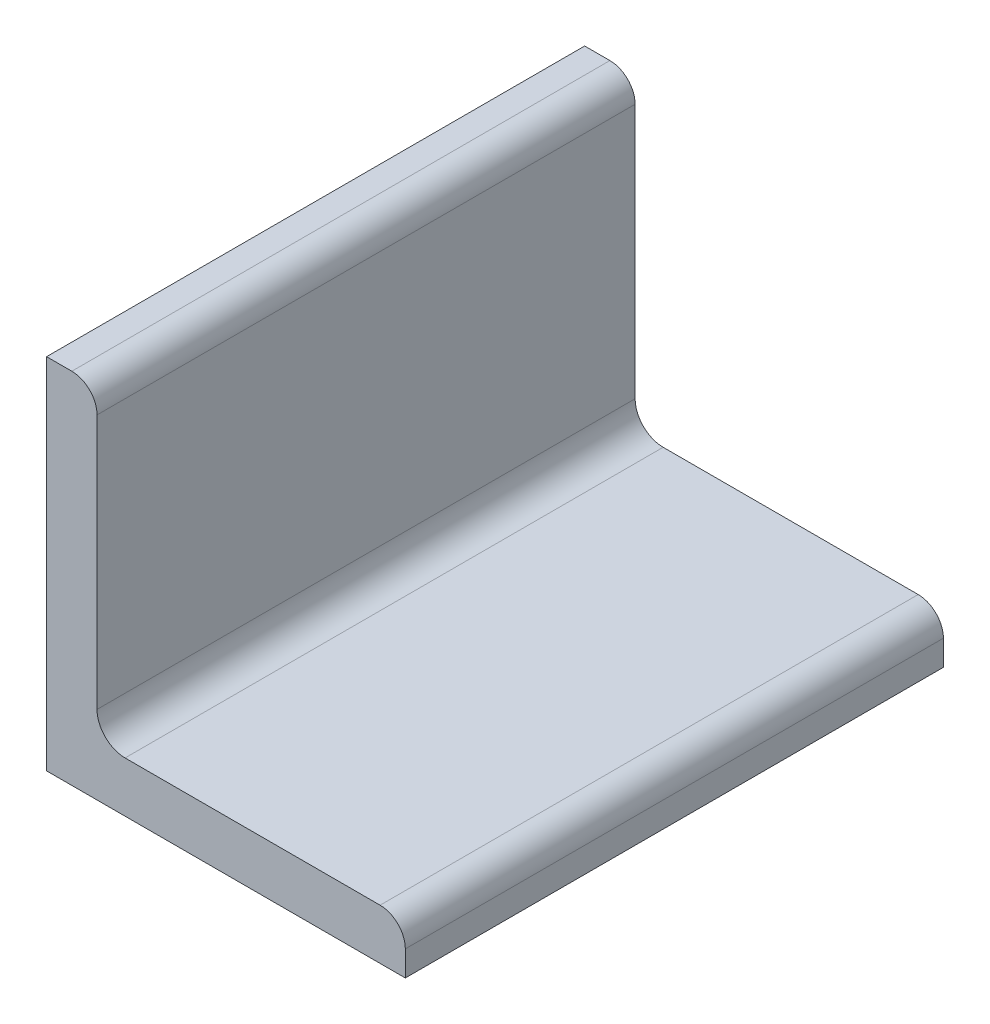
ISO-10303-21;
HEADER;
FILE_DESCRIPTION(('STEP AP214'),'2;1');
FILE_NAME('part.step','',(''),(''),'','','');
FILE_SCHEMA(('AUTOMOTIVE_DESIGN { 1 0 10303 214 1 1 1 1 }'));
ENDSEC;
DATA;
#1=APPLICATION_CONTEXT('core data for automotive mechanical design processes');
#2=APPLICATION_PROTOCOL_DEFINITION('international standard','automotive_design',2000,#1);
#3=PRODUCT_CONTEXT('',#1,'mechanical');
#4=PRODUCT('Part','Part','',(#3));
#5=PRODUCT_RELATED_PRODUCT_CATEGORY('part','',(#4));
#6=PRODUCT_DEFINITION_FORMATION('','',#4);
#7=PRODUCT_DEFINITION_CONTEXT('part definition',#1,'design');
#8=PRODUCT_DEFINITION('design','',#6,#7);
#9=PRODUCT_DEFINITION_SHAPE('','',#8);
#10=(LENGTH_UNIT() NAMED_UNIT(*) SI_UNIT(.MILLI.,.METRE.));
#11=(NAMED_UNIT(*) PLANE_ANGLE_UNIT() SI_UNIT($,.RADIAN.));
#12=(NAMED_UNIT(*) SI_UNIT($,.STERADIAN.) SOLID_ANGLE_UNIT());
#13=UNCERTAINTY_MEASURE_WITH_UNIT(LENGTH_MEASURE(1.E-05),#10,'distance_accuracy_value','');
#14=(GEOMETRIC_REPRESENTATION_CONTEXT(3) GLOBAL_UNCERTAINTY_ASSIGNED_CONTEXT((#13)) GLOBAL_UNIT_ASSIGNED_CONTEXT((#10,
#11,#12)) REPRESENTATION_CONTEXT('',''));
#15=CARTESIAN_POINT('',(0.,0.,0.));
#16=DIRECTION('',(0.,0.,1.));
#17=DIRECTION('',(1.,0.,0.));
#18=AXIS2_PLACEMENT_3D('',#15,#16,#17);
#19=CARTESIAN_POINT('',(1.17355224493876,203.678837479772,304.8));
#20=DIRECTION('',(1.,0.,0.));
#21=DIRECTION('',(0.,0.,-1.));
#22=AXIS2_PLACEMENT_3D('',#19,#20,#21);
#23=PLANE('',#22);
#24=DIRECTION('',(0.,-1.,0.));
#25=VECTOR('',#24,1.);
#26=CARTESIAN_POINT('',(1.17355224493876,203.678837479772,0.));
#27=LINE('',#26,#25);
#28=CARTESIAN_POINT('',(1.17355224493876,203.678837479772,0.));
#29=VERTEX_POINT('',#28);
#30=CARTESIAN_POINT('',(1.17355224493876,0.478837479771708,0.));
#31=VERTEX_POINT('',#30);
#32=EDGE_CURVE('E135',#29,#31,#27,.T.);
#33=ORIENTED_EDGE('',*,*,#32,.T.);
#34=DIRECTION('',(0.,0.,-1.));
#35=VECTOR('',#34,1.);
#36=CARTESIAN_POINT('',(1.17355224493876,0.478837479771708,304.8));
#37=LINE('',#36,#35);
#38=CARTESIAN_POINT('',(1.17355224493876,0.478837479771708,304.8));
#39=VERTEX_POINT('',#38);
#40=EDGE_CURVE('E11',#39,#31,#37,.T.);
#41=ORIENTED_EDGE('',*,*,#40,.F.);
#42=DIRECTION('',(0.,-1.,0.));
#43=VECTOR('',#42,1.);
#44=CARTESIAN_POINT('',(1.17355224493876,203.678837479772,304.8));
#45=LINE('',#44,#43);
#46=CARTESIAN_POINT('',(1.17355224493876,203.678837479772,304.8));
#47=VERTEX_POINT('',#46);
#48=EDGE_CURVE('E151',#47,#39,#45,.T.);
#49=ORIENTED_EDGE('',*,*,#48,.F.);
#50=DIRECTION('',(0.,0.,-1.));
#51=VECTOR('',#50,1.);
#52=CARTESIAN_POINT('',(1.17355224493876,203.678837479772,304.8));
#53=LINE('',#52,#51);
#54=EDGE_CURVE('E131',#47,#29,#53,.T.);
#55=ORIENTED_EDGE('',*,*,#54,.T.);
#56=EDGE_LOOP('',(#33,#41,#49,#55));
#57=FACE_BOUND('',#56,.T.);
#58=ADVANCED_FACE('F33',(#57),#23,.F.);
#59=CARTESIAN_POINT('',(1.17355224493876,0.478837479771708,304.8));
#60=DIRECTION('',(0.,1.,0.));
#61=DIRECTION('',(0.,0.,1.));
#62=AXIS2_PLACEMENT_3D('',#59,#60,#61);
#63=PLANE('',#62);
#64=DIRECTION('',(1.,0.,0.));
#65=VECTOR('',#64,1.);
#66=CARTESIAN_POINT('',(1.17355224493876,0.478837479771708,0.));
#67=LINE('',#66,#65);
#68=CARTESIAN_POINT('',(204.373552244939,0.478837479771708,0.));
#69=VERTEX_POINT('',#68);
#70=EDGE_CURVE('E138',#31,#69,#67,.T.);
#71=ORIENTED_EDGE('',*,*,#70,.T.);
#72=DIRECTION('',(0.,0.,-1.));
#73=VECTOR('',#72,1.);
#74=CARTESIAN_POINT('',(204.373552244939,0.478837479771708,304.8));
#75=LINE('',#74,#73);
#76=CARTESIAN_POINT('',(204.373552244939,0.478837479771708,304.8));
#77=VERTEX_POINT('',#76);
#78=EDGE_CURVE('E41',#77,#69,#75,.T.);
#79=ORIENTED_EDGE('',*,*,#78,.F.);
#80=DIRECTION('',(1.,0.,0.));
#81=VECTOR('',#80,1.);
#82=CARTESIAN_POINT('',(1.17355224493876,0.478837479771708,304.8));
#83=LINE('',#82,#81);
#84=EDGE_CURVE('E95',#39,#77,#83,.T.);
#85=ORIENTED_EDGE('',*,*,#84,.F.);
#86=ORIENTED_EDGE('',*,*,#40,.T.);
#87=EDGE_LOOP('',(#71,#79,#85,#86));
#88=FACE_BOUND('',#87,.T.);
#89=ADVANCED_FACE('F194',(#88),#63,.F.);
#90=CARTESIAN_POINT('',(204.373552244939,0.478837479771708,304.8));
#91=DIRECTION('',(-1.,0.,0.));
#92=DIRECTION('',(0.,0.,1.));
#93=AXIS2_PLACEMENT_3D('',#90,#91,#92);
#94=PLANE('',#93);
#95=DIRECTION('',(0.,1.,0.));
#96=VECTOR('',#95,1.);
#97=CARTESIAN_POINT('',(204.373552244939,0.478837479771708,0.));
#98=LINE('',#97,#96);
#99=CARTESIAN_POINT('',(204.373552244939,14.7663374797717,0.));
#100=VERTEX_POINT('',#99);
#101=EDGE_CURVE('E140',#69,#100,#98,.T.);
#102=ORIENTED_EDGE('',*,*,#101,.T.);
#103=DIRECTION('',(0.,0.,-1.));
#104=VECTOR('',#103,1.);
#105=CARTESIAN_POINT('',(204.373552244939,14.7663374797717,304.8));
#106=LINE('',#105,#104);
#107=CARTESIAN_POINT('',(204.373552244939,14.7663374797717,304.8));
#108=VERTEX_POINT('',#107);
#109=EDGE_CURVE('E161',#108,#100,#106,.T.);
#110=ORIENTED_EDGE('',*,*,#109,.F.);
#111=DIRECTION('',(0.,1.,0.));
#112=VECTOR('',#111,1.);
#113=CARTESIAN_POINT('',(204.373552244939,0.478837479771708,304.8));
#114=LINE('',#113,#112);
#115=EDGE_CURVE('E169',#77,#108,#114,.T.);
#116=ORIENTED_EDGE('',*,*,#115,.F.);
#117=ORIENTED_EDGE('',*,*,#78,.T.);
#118=EDGE_LOOP('',(#102,#110,#116,#117));
#119=FACE_BOUND('',#118,.T.);
#120=ADVANCED_FACE('F167',(#119),#94,.F.);
#121=CARTESIAN_POINT('',(190.086052244939,14.7663374797717,304.8));
#122=DIRECTION('',(0.,0.,-1.));
#123=DIRECTION('',(-1.,0.,0.));
#124=AXIS2_PLACEMENT_3D('',#121,#122,#123);
#125=CYLINDRICAL_SURFACE('',#124,14.2875);
#126=CARTESIAN_POINT('',(190.086052244939,14.7663374797717,0.));
#127=DIRECTION('',(0.,0.,1.));
#128=DIRECTION('',(1.,0.,0.));
#129=AXIS2_PLACEMENT_3D('',#126,#127,#128);
#130=CIRCLE('',#129,14.2875);
#131=CARTESIAN_POINT('',(190.086052244939,29.0538374797717,0.));
#132=VERTEX_POINT('',#131);
#133=EDGE_CURVE('E142',#100,#132,#130,.T.);
#134=ORIENTED_EDGE('',*,*,#133,.T.);
#135=DIRECTION('',(0.,0.,-1.));
#136=VECTOR('',#135,1.);
#137=CARTESIAN_POINT('',(190.086052244939,29.0538374797717,304.8));
#138=LINE('',#137,#136);
#139=CARTESIAN_POINT('',(190.086052244939,29.0538374797717,304.8));
#140=VERTEX_POINT('',#139);
#141=EDGE_CURVE('E158',#140,#132,#138,.T.);
#142=ORIENTED_EDGE('',*,*,#141,.F.);
#143=CARTESIAN_POINT('',(190.086052244939,14.7663374797717,304.8));
#144=DIRECTION('',(0.,0.,1.));
#145=DIRECTION('',(1.,0.,0.));
#146=AXIS2_PLACEMENT_3D('',#143,#144,#145);
#147=CIRCLE('',#146,14.2875);
#148=EDGE_CURVE('E185',#108,#140,#147,.T.);
#149=ORIENTED_EDGE('',*,*,#148,.F.);
#150=ORIENTED_EDGE('',*,*,#109,.T.);
#151=EDGE_LOOP('',(#134,#142,#149,#150));
#152=FACE_BOUND('',#151,.T.);
#153=ADVANCED_FACE('F178',(#152),#125,.T.);
#154=CARTESIAN_POINT('',(190.086052244939,29.0538374797717,304.8));
#155=DIRECTION('',(0.,-1.,0.));
#156=DIRECTION('',(0.,0.,-1.));
#157=AXIS2_PLACEMENT_3D('',#154,#155,#156);
#158=PLANE('',#157);
#159=DIRECTION('',(-1.,0.,0.));
#160=VECTOR('',#159,1.);
#161=CARTESIAN_POINT('',(190.086052244939,29.0538374797717,0.));
#162=LINE('',#161,#160);
#163=CARTESIAN_POINT('',(45.6235522449388,29.0538374797717,0.));
#164=VERTEX_POINT('',#163);
#165=EDGE_CURVE('E144',#132,#164,#162,.T.);
#166=ORIENTED_EDGE('',*,*,#165,.T.);
#167=DIRECTION('',(0.,0.,-1.));
#168=VECTOR('',#167,1.);
#169=CARTESIAN_POINT('',(45.6235522449388,29.0538374797717,304.8));
#170=LINE('',#169,#168);
#171=CARTESIAN_POINT('',(45.6235522449388,29.0538374797717,304.8));
#172=VERTEX_POINT('',#171);
#173=EDGE_CURVE('E155',#172,#164,#170,.T.);
#174=ORIENTED_EDGE('',*,*,#173,.F.);
#175=DIRECTION('',(-1.,0.,0.));
#176=VECTOR('',#175,1.);
#177=CARTESIAN_POINT('',(190.086052244939,29.0538374797717,304.8));
#178=LINE('',#177,#176);
#179=EDGE_CURVE('E184',#140,#172,#178,.T.);
#180=ORIENTED_EDGE('',*,*,#179,.F.);
#181=ORIENTED_EDGE('',*,*,#141,.T.);
#182=EDGE_LOOP('',(#166,#174,#180,#181));
#183=FACE_BOUND('',#182,.T.);
#184=ADVANCED_FACE('F182',(#183),#158,.F.);
#185=CARTESIAN_POINT('',(45.6235522449387,44.9288374797717,304.8));
#186=DIRECTION('',(0.,0.,-1.));
#187=DIRECTION('',(-1.,0.,0.));
#188=AXIS2_PLACEMENT_3D('',#185,#186,#187);
#189=CYLINDRICAL_SURFACE('',#188,15.875);
#190=CARTESIAN_POINT('',(45.6235522449387,44.9288374797717,0.));
#191=DIRECTION('',(0.,0.,-1.));
#192=DIRECTION('',(1.,0.,0.));
#193=AXIS2_PLACEMENT_3D('',#190,#191,#192);
#194=CIRCLE('',#193,15.875);
#195=CARTESIAN_POINT('',(29.7485522449388,44.9288374797717,0.));
#196=VERTEX_POINT('',#195);
#197=EDGE_CURVE('E146',#164,#196,#194,.T.);
#198=ORIENTED_EDGE('',*,*,#197,.T.);
#199=DIRECTION('',(0.,0.,-1.));
#200=VECTOR('',#199,1.);
#201=CARTESIAN_POINT('',(29.7485522449388,44.9288374797717,304.8));
#202=LINE('',#201,#200);
#203=CARTESIAN_POINT('',(29.7485522449388,44.9288374797717,304.8));
#204=VERTEX_POINT('',#203);
#205=EDGE_CURVE('E126',#204,#196,#202,.T.);
#206=ORIENTED_EDGE('',*,*,#205,.F.);
#207=CARTESIAN_POINT('',(45.6235522449387,44.9288374797717,304.8));
#208=DIRECTION('',(0.,0.,-1.));
#209=DIRECTION('',(1.,0.,0.));
#210=AXIS2_PLACEMENT_3D('',#207,#208,#209);
#211=CIRCLE('',#210,15.875);
#212=EDGE_CURVE('E117',#172,#204,#211,.T.);
#213=ORIENTED_EDGE('',*,*,#212,.F.);
#214=ORIENTED_EDGE('',*,*,#173,.T.);
#215=EDGE_LOOP('',(#198,#206,#213,#214));
#216=FACE_BOUND('',#215,.T.);
#217=ADVANCED_FACE('F206',(#216),#189,.F.);
#218=CARTESIAN_POINT('',(29.7485522449388,44.9288374797717,304.8));
#219=DIRECTION('',(-1.,0.,0.));
#220=DIRECTION('',(0.,0.,1.));
#221=AXIS2_PLACEMENT_3D('',#218,#219,#220);
#222=PLANE('',#221);
#223=DIRECTION('',(0.,1.,0.));
#224=VECTOR('',#223,1.);
#225=CARTESIAN_POINT('',(29.7485522449388,44.9288374797717,0.));
#226=LINE('',#225,#224);
#227=CARTESIAN_POINT('',(29.7485522449388,189.391337479772,0.));
#228=VERTEX_POINT('',#227);
#229=EDGE_CURVE('E125',#196,#228,#226,.T.);
#230=ORIENTED_EDGE('',*,*,#229,.T.);
#231=DIRECTION('',(0.,0.,-1.));
#232=VECTOR('',#231,1.);
#233=CARTESIAN_POINT('',(29.7485522449388,189.391337479772,304.8));
#234=LINE('',#233,#232);
#235=CARTESIAN_POINT('',(29.7485522449388,189.391337479772,304.8));
#236=VERTEX_POINT('',#235);
#237=EDGE_CURVE('E122',#236,#228,#234,.T.);
#238=ORIENTED_EDGE('',*,*,#237,.F.);
#239=DIRECTION('',(0.,1.,0.));
#240=VECTOR('',#239,1.);
#241=CARTESIAN_POINT('',(29.7485522449388,44.9288374797717,304.8));
#242=LINE('',#241,#240);
#243=EDGE_CURVE('E111',#204,#236,#242,.T.);
#244=ORIENTED_EDGE('',*,*,#243,.F.);
#245=ORIENTED_EDGE('',*,*,#205,.T.);
#246=EDGE_LOOP('',(#230,#238,#244,#245));
#247=FACE_BOUND('',#246,.T.);
#248=ADVANCED_FACE('F123',(#247),#222,.F.);
#249=CARTESIAN_POINT('',(15.4610522449388,189.391337479772,304.8));
#250=DIRECTION('',(0.,0.,-1.));
#251=DIRECTION('',(-1.,0.,0.));
#252=AXIS2_PLACEMENT_3D('',#249,#250,#251);
#253=CYLINDRICAL_SURFACE('',#252,14.2875);
#254=CARTESIAN_POINT('',(15.4610522449388,189.391337479772,0.));
#255=DIRECTION('',(0.,0.,1.));
#256=DIRECTION('',(1.,0.,0.));
#257=AXIS2_PLACEMENT_3D('',#254,#255,#256);
#258=CIRCLE('',#257,14.2875);
#259=CARTESIAN_POINT('',(15.4610522449388,203.678837479772,0.));
#260=VERTEX_POINT('',#259);
#261=EDGE_CURVE('E81',#228,#260,#258,.T.);
#262=ORIENTED_EDGE('',*,*,#261,.T.);
#263=DIRECTION('',(0.,0.,-1.));
#264=VECTOR('',#263,1.);
#265=CARTESIAN_POINT('',(15.4610522449388,203.678837479772,304.8));
#266=LINE('',#265,#264);
#267=CARTESIAN_POINT('',(15.4610522449388,203.678837479772,304.8));
#268=VERTEX_POINT('',#267);
#269=EDGE_CURVE('E127',#268,#260,#266,.T.);
#270=ORIENTED_EDGE('',*,*,#269,.F.);
#271=CARTESIAN_POINT('',(15.4610522449388,189.391337479772,304.8));
#272=DIRECTION('',(0.,0.,1.));
#273=DIRECTION('',(1.,0.,0.));
#274=AXIS2_PLACEMENT_3D('',#271,#272,#273);
#275=CIRCLE('',#274,14.2875);
#276=EDGE_CURVE('E115',#236,#268,#275,.T.);
#277=ORIENTED_EDGE('',*,*,#276,.F.);
#278=ORIENTED_EDGE('',*,*,#237,.T.);
#279=EDGE_LOOP('',(#262,#270,#277,#278));
#280=FACE_BOUND('',#279,.T.);
#281=ADVANCED_FACE('F129',(#280),#253,.T.);
#282=CARTESIAN_POINT('',(15.4610522449388,203.678837479772,304.8));
#283=DIRECTION('',(0.,-1.,0.));
#284=DIRECTION('',(0.,0.,-1.));
#285=AXIS2_PLACEMENT_3D('',#282,#283,#284);
#286=PLANE('',#285);
#287=DIRECTION('',(-1.,0.,0.));
#288=VECTOR('',#287,1.);
#289=CARTESIAN_POINT('',(15.4610522449388,203.678837479772,0.));
#290=LINE('',#289,#288);
#291=EDGE_CURVE('E87',#260,#29,#290,.T.);
#292=ORIENTED_EDGE('',*,*,#291,.T.);
#293=ORIENTED_EDGE('',*,*,#54,.F.);
#294=DIRECTION('',(-1.,0.,0.));
#295=VECTOR('',#294,1.);
#296=CARTESIAN_POINT('',(15.4610522449388,203.678837479772,304.8));
#297=LINE('',#296,#295);
#298=EDGE_CURVE('E49',#268,#47,#297,.T.);
#299=ORIENTED_EDGE('',*,*,#298,.F.);
#300=ORIENTED_EDGE('',*,*,#269,.T.);
#301=EDGE_LOOP('',(#292,#293,#299,#300));
#302=FACE_BOUND('',#301,.T.);
#303=ADVANCED_FACE('F214',(#302),#286,.F.);
#304=CARTESIAN_POINT('',(190.086052244939,14.7663374797717,304.8));
#305=DIRECTION('',(0.,0.,1.));
#306=DIRECTION('',(1.,0.,0.));
#307=AXIS2_PLACEMENT_3D('',#304,#305,#306);
#308=PLANE('',#307);
#309=ORIENTED_EDGE('',*,*,#48,.T.);
#310=ORIENTED_EDGE('',*,*,#84,.T.);
#311=ORIENTED_EDGE('',*,*,#115,.T.);
#312=ORIENTED_EDGE('',*,*,#148,.T.);
#313=ORIENTED_EDGE('',*,*,#179,.T.);
#314=ORIENTED_EDGE('',*,*,#212,.T.);
#315=ORIENTED_EDGE('',*,*,#243,.T.);
#316=ORIENTED_EDGE('',*,*,#276,.T.);
#317=ORIENTED_EDGE('',*,*,#298,.T.);
#318=EDGE_LOOP('',(#309,#310,#311,#312,#313,#314,#315,#316,#317));
#319=FACE_BOUND('',#318,.T.);
#320=ADVANCED_FACE('F113',(#319),#308,.T.);
#321=CARTESIAN_POINT('',(190.086052244939,14.7663374797717,0.));
#322=DIRECTION('',(0.,0.,1.));
#323=DIRECTION('',(1.,0.,0.));
#324=AXIS2_PLACEMENT_3D('',#321,#322,#323);
#325=PLANE('',#324);
#326=ORIENTED_EDGE('',*,*,#32,.F.);
#327=ORIENTED_EDGE('',*,*,#291,.F.);
#328=ORIENTED_EDGE('',*,*,#261,.F.);
#329=ORIENTED_EDGE('',*,*,#229,.F.);
#330=ORIENTED_EDGE('',*,*,#197,.F.);
#331=ORIENTED_EDGE('',*,*,#165,.F.);
#332=ORIENTED_EDGE('',*,*,#133,.F.);
#333=ORIENTED_EDGE('',*,*,#101,.F.);
#334=ORIENTED_EDGE('',*,*,#70,.F.);
#335=EDGE_LOOP('',(#326,#327,#328,#329,#330,#331,#332,#333,#334));
#336=FACE_BOUND('',#335,.T.);
#337=ADVANCED_FACE('F173',(#336),#325,.F.);
#338=CLOSED_SHELL('',(#58,#89,#120,#153,#184,#217,#248,#281,#303,#320,#337));
#339=MANIFOLD_SOLID_BREP('B2',#338);
#340=ADVANCED_BREP_SHAPE_REPRESENTATION('',(#18,#339),#14);
#341=SHAPE_DEFINITION_REPRESENTATION(#9,#340);
ENDSEC;
END-ISO-10303-21;
